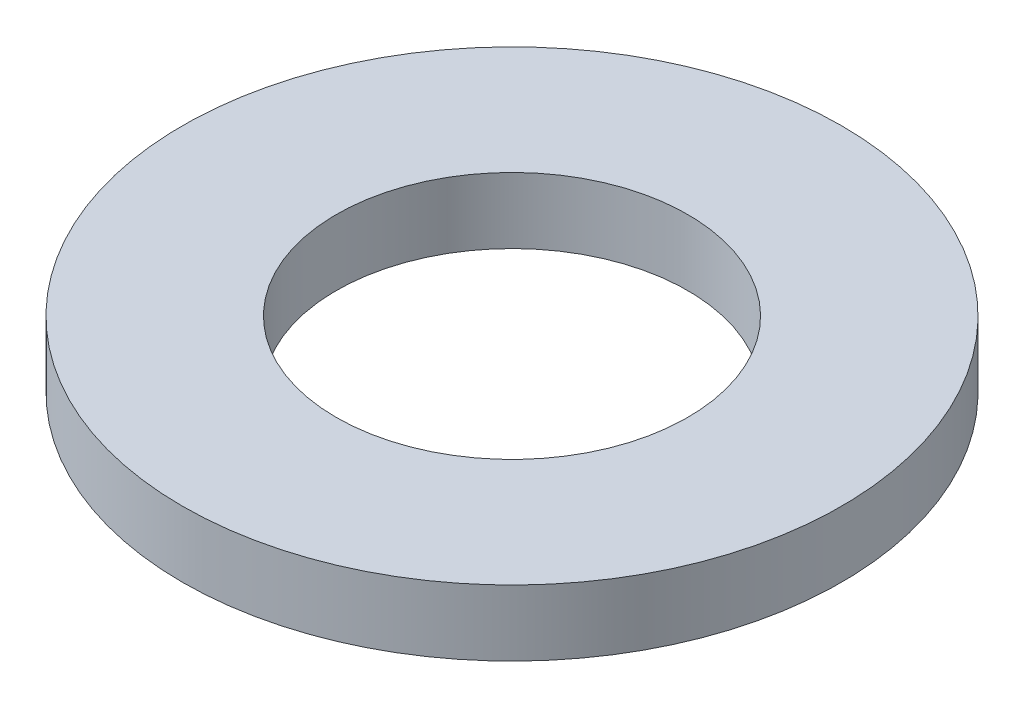
ISO-10303-21;
HEADER;
FILE_DESCRIPTION(('STEP AP214'),'2;1');
FILE_NAME('part.step','',(''),(''),'','','');
FILE_SCHEMA(('AUTOMOTIVE_DESIGN { 1 0 10303 214 1 1 1 1 }'));
ENDSEC;
DATA;
#1=APPLICATION_CONTEXT('core data for automotive mechanical design processes');
#2=APPLICATION_PROTOCOL_DEFINITION('international standard','automotive_design',2000,#1);
#3=PRODUCT_CONTEXT('',#1,'mechanical');
#4=PRODUCT('Part','Part','',(#3));
#5=PRODUCT_RELATED_PRODUCT_CATEGORY('part','',(#4));
#6=PRODUCT_DEFINITION_FORMATION('','',#4);
#7=PRODUCT_DEFINITION_CONTEXT('part definition',#1,'design');
#8=PRODUCT_DEFINITION('design','',#6,#7);
#9=PRODUCT_DEFINITION_SHAPE('','',#8);
#10=(LENGTH_UNIT() NAMED_UNIT(*) SI_UNIT(.MILLI.,.METRE.));
#11=(NAMED_UNIT(*) PLANE_ANGLE_UNIT() SI_UNIT($,.RADIAN.));
#12=(NAMED_UNIT(*) SI_UNIT($,.STERADIAN.) SOLID_ANGLE_UNIT());
#13=UNCERTAINTY_MEASURE_WITH_UNIT(LENGTH_MEASURE(1.E-05),#10,'distance_accuracy_value','');
#14=(GEOMETRIC_REPRESENTATION_CONTEXT(3) GLOBAL_UNCERTAINTY_ASSIGNED_CONTEXT((#13)) GLOBAL_UNIT_ASSIGNED_CONTEXT((#10,
#11,#12)) REPRESENTATION_CONTEXT('',''));
#15=CARTESIAN_POINT('',(0.,0.,0.));
#16=DIRECTION('',(0.,0.,1.));
#17=DIRECTION('',(1.,0.,0.));
#18=AXIS2_PLACEMENT_3D('',#15,#16,#17);
#19=CARTESIAN_POINT('',(0.,1.5,0.));
#20=DIRECTION('',(0.,1.,0.));
#21=DIRECTION('',(0.,0.,1.));
#22=AXIS2_PLACEMENT_3D('',#19,#20,#21);
#23=PLANE('',#22);
#24=CARTESIAN_POINT('',(0.,1.5,0.));
#25=DIRECTION('',(0.,1.,0.));
#26=DIRECTION('',(0.,0.,1.));
#27=AXIS2_PLACEMENT_3D('',#24,#25,#26);
#28=CIRCLE('',#27,7.5);
#29=CARTESIAN_POINT('',(0.,1.5,7.5));
#30=VERTEX_POINT('',#29);
#31=EDGE_CURVE('E10',#30,#30,#28,.T.);
#32=ORIENTED_EDGE('',*,*,#31,.T.);
#33=EDGE_LOOP('',(#32));
#34=FACE_BOUND('',#33,.T.);
#35=CARTESIAN_POINT('',(0.,1.5,0.));
#36=DIRECTION('',(0.,1.,0.));
#37=DIRECTION('',(0.,0.,1.));
#38=AXIS2_PLACEMENT_3D('',#35,#36,#37);
#39=CIRCLE('',#38,4.);
#40=CARTESIAN_POINT('',(0.,1.5,4.));
#41=VERTEX_POINT('',#40);
#42=EDGE_CURVE('E43',#41,#41,#39,.T.);
#43=ORIENTED_EDGE('',*,*,#42,.F.);
#44=EDGE_LOOP('',(#43));
#45=FACE_BOUND('',#44,.T.);
#46=ADVANCED_FACE('F32',(#34,#45),#23,.T.);
#47=CARTESIAN_POINT('',(0.,0.,0.));
#48=DIRECTION('',(0.,1.,0.));
#49=DIRECTION('',(0.,0.,1.));
#50=AXIS2_PLACEMENT_3D('',#47,#48,#49);
#51=PLANE('',#50);
#52=CARTESIAN_POINT('',(0.,0.,0.));
#53=DIRECTION('',(0.,1.,0.));
#54=DIRECTION('',(0.,0.,1.));
#55=AXIS2_PLACEMENT_3D('',#52,#53,#54);
#56=CIRCLE('',#55,7.5);
#57=CARTESIAN_POINT('',(0.,0.,7.5));
#58=VERTEX_POINT('',#57);
#59=EDGE_CURVE('E36',#58,#58,#56,.T.);
#60=ORIENTED_EDGE('',*,*,#59,.F.);
#61=EDGE_LOOP('',(#60));
#62=FACE_BOUND('',#61,.T.);
#63=CARTESIAN_POINT('',(0.,0.,0.));
#64=DIRECTION('',(0.,1.,0.));
#65=DIRECTION('',(0.,0.,1.));
#66=AXIS2_PLACEMENT_3D('',#63,#64,#65);
#67=CIRCLE('',#66,4.);
#68=CARTESIAN_POINT('',(0.,0.,4.));
#69=VERTEX_POINT('',#68);
#70=EDGE_CURVE('E45',#69,#69,#67,.T.);
#71=ORIENTED_EDGE('',*,*,#70,.T.);
#72=EDGE_LOOP('',(#71));
#73=FACE_BOUND('',#72,.T.);
#74=ADVANCED_FACE('F55',(#62,#73),#51,.F.);
#75=CARTESIAN_POINT('',(0.,1.5,0.));
#76=DIRECTION('',(0.,-1.,0.));
#77=DIRECTION('',(0.,0.,-1.));
#78=AXIS2_PLACEMENT_3D('',#75,#76,#77);
#79=CYLINDRICAL_SURFACE('',#78,7.5);
#80=ORIENTED_EDGE('',*,*,#31,.F.);
#81=EDGE_LOOP('',(#80));
#82=FACE_BOUND('',#81,.T.);
#83=ORIENTED_EDGE('',*,*,#59,.T.);
#84=EDGE_LOOP('',(#83));
#85=FACE_BOUND('',#84,.T.);
#86=ADVANCED_FACE('F34',(#82,#85),#79,.T.);
#87=CARTESIAN_POINT('',(0.,1.5,0.));
#88=DIRECTION('',(0.,-1.,0.));
#89=DIRECTION('',(0.,0.,-1.));
#90=AXIS2_PLACEMENT_3D('',#87,#88,#89);
#91=CYLINDRICAL_SURFACE('',#90,4.);
#92=ORIENTED_EDGE('',*,*,#42,.T.);
#93=EDGE_LOOP('',(#92));
#94=FACE_BOUND('',#93,.T.);
#95=ORIENTED_EDGE('',*,*,#70,.F.);
#96=EDGE_LOOP('',(#95));
#97=FACE_BOUND('',#96,.T.);
#98=ADVANCED_FACE('F51',(#94,#97),#91,.F.);
#99=CLOSED_SHELL('',(#46,#74,#86,#98));
#100=MANIFOLD_SOLID_BREP('B2',#99);
#101=ADVANCED_BREP_SHAPE_REPRESENTATION('',(#18,#100),#14);
#102=SHAPE_DEFINITION_REPRESENTATION(#9,#101);
ENDSEC;
END-ISO-10303-21;
